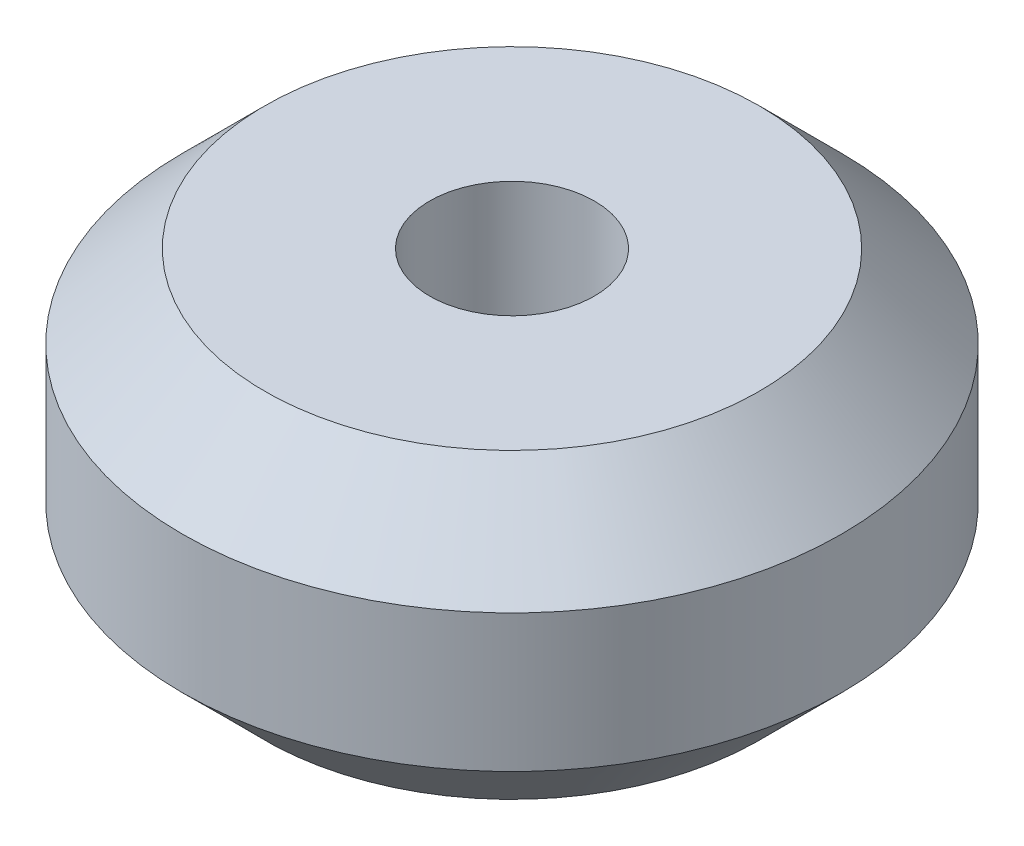
ISO-10303-21;
HEADER;
FILE_DESCRIPTION(('STEP AP214'),'2;1');
FILE_NAME('part.step','',(''),(''),'','','');
FILE_SCHEMA(('AUTOMOTIVE_DESIGN { 1 0 10303 214 1 1 1 1 }'));
ENDSEC;
DATA;
#1=APPLICATION_CONTEXT('core data for automotive mechanical design processes');
#2=APPLICATION_PROTOCOL_DEFINITION('international standard','automotive_design',2000,#1);
#3=PRODUCT_CONTEXT('',#1,'mechanical');
#4=PRODUCT('Part','Part','',(#3));
#5=PRODUCT_RELATED_PRODUCT_CATEGORY('part','',(#4));
#6=PRODUCT_DEFINITION_FORMATION('','',#4);
#7=PRODUCT_DEFINITION_CONTEXT('part definition',#1,'design');
#8=PRODUCT_DEFINITION('design','',#6,#7);
#9=PRODUCT_DEFINITION_SHAPE('','',#8);
#10=(LENGTH_UNIT() NAMED_UNIT(*) SI_UNIT(.MILLI.,.METRE.));
#11=(NAMED_UNIT(*) PLANE_ANGLE_UNIT() SI_UNIT($,.RADIAN.));
#12=(NAMED_UNIT(*) SI_UNIT($,.STERADIAN.) SOLID_ANGLE_UNIT());
#13=UNCERTAINTY_MEASURE_WITH_UNIT(LENGTH_MEASURE(1.E-05),#10,'distance_accuracy_value','');
#14=(GEOMETRIC_REPRESENTATION_CONTEXT(3) GLOBAL_UNCERTAINTY_ASSIGNED_CONTEXT((#13)) GLOBAL_UNIT_ASSIGNED_CONTEXT((#10,
#11,#12)) REPRESENTATION_CONTEXT('',''));
#15=CARTESIAN_POINT('',(0.,0.,0.));
#16=DIRECTION('',(0.,0.,1.));
#17=DIRECTION('',(1.,0.,0.));
#18=AXIS2_PLACEMENT_3D('',#15,#16,#17);
#19=CARTESIAN_POINT('',(0.,5.5,0.));
#20=DIRECTION('',(0.,-1.,0.));
#21=DIRECTION('',(0.,0.,-1.));
#22=AXIS2_PLACEMENT_3D('',#19,#20,#21);
#23=PLANE('',#22);
#24=CARTESIAN_POINT('',(0.,5.5,0.));
#25=DIRECTION('',(0.,-1.,0.));
#26=DIRECTION('',(0.,0.,-1.));
#27=AXIS2_PLACEMENT_3D('',#24,#25,#26);
#28=CIRCLE('',#27,9.);
#29=CARTESIAN_POINT('',(0.,5.5,-9.));
#30=VERTEX_POINT('',#29);
#31=EDGE_CURVE('E43',#30,#30,#28,.T.);
#32=ORIENTED_EDGE('',*,*,#31,.F.);
#33=EDGE_LOOP('',(#32));
#34=FACE_BOUND('',#33,.T.);
#35=CARTESIAN_POINT('',(0.,5.5,0.));
#36=DIRECTION('',(0.,-1.,0.));
#37=DIRECTION('',(0.,0.,-1.));
#38=AXIS2_PLACEMENT_3D('',#35,#36,#37);
#39=CIRCLE('',#38,3.);
#40=CARTESIAN_POINT('',(0.,5.5,-3.));
#41=VERTEX_POINT('',#40);
#42=EDGE_CURVE('E10',#41,#41,#39,.T.);
#43=ORIENTED_EDGE('',*,*,#42,.T.);
#44=EDGE_LOOP('',(#43));
#45=FACE_BOUND('',#44,.T.);
#46=ADVANCED_FACE('F33',(#34,#45),#23,.F.);
#47=CARTESIAN_POINT('',(0.,0.,0.));
#48=DIRECTION('',(0.,-1.,0.));
#49=DIRECTION('',(0.,0.,-1.));
#50=AXIS2_PLACEMENT_3D('',#47,#48,#49);
#51=CYLINDRICAL_SURFACE('',#50,3.);
#52=ORIENTED_EDGE('',*,*,#42,.F.);
#53=EDGE_LOOP('',(#52));
#54=FACE_BOUND('',#53,.T.);
#55=CARTESIAN_POINT('',(0.,-5.5,0.));
#56=DIRECTION('',(0.,-1.,0.));
#57=DIRECTION('',(0.,0.,-1.));
#58=AXIS2_PLACEMENT_3D('',#55,#56,#57);
#59=CIRCLE('',#58,3.);
#60=CARTESIAN_POINT('',(0.,-5.5,-3.));
#61=VERTEX_POINT('',#60);
#62=EDGE_CURVE('E47',#61,#61,#59,.T.);
#63=ORIENTED_EDGE('',*,*,#62,.T.);
#64=EDGE_LOOP('',(#63));
#65=FACE_BOUND('',#64,.T.);
#66=ADVANCED_FACE('F72',(#54,#65),#51,.F.);
#67=CARTESIAN_POINT('',(0.,0.,0.));
#68=DIRECTION('',(0.,-1.,0.));
#69=DIRECTION('',(0.,0.,-1.));
#70=AXIS2_PLACEMENT_3D('',#67,#68,#69);
#71=CYLINDRICAL_SURFACE('',#70,12.);
#72=CARTESIAN_POINT('',(0.,2.5,0.));
#73=DIRECTION('',(0.,-1.,0.));
#74=DIRECTION('',(0.,0.,-1.));
#75=AXIS2_PLACEMENT_3D('',#72,#73,#74);
#76=CIRCLE('',#75,12.);
#77=CARTESIAN_POINT('',(0.,2.5,-12.));
#78=VERTEX_POINT('',#77);
#79=EDGE_CURVE('E39',#78,#78,#76,.T.);
#80=ORIENTED_EDGE('',*,*,#79,.T.);
#81=EDGE_LOOP('',(#80));
#82=FACE_BOUND('',#81,.T.);
#83=CARTESIAN_POINT('',(0.,-2.5,0.));
#84=DIRECTION('',(0.,-1.,0.));
#85=DIRECTION('',(0.,0.,-1.));
#86=AXIS2_PLACEMENT_3D('',#83,#84,#85);
#87=CIRCLE('',#86,12.);
#88=CARTESIAN_POINT('',(0.,-2.5,-12.));
#89=VERTEX_POINT('',#88);
#90=EDGE_CURVE('E52',#89,#89,#87,.T.);
#91=ORIENTED_EDGE('',*,*,#90,.F.);
#92=EDGE_LOOP('',(#91));
#93=FACE_BOUND('',#92,.T.);
#94=ADVANCED_FACE('F77',(#82,#93),#71,.T.);
#95=CARTESIAN_POINT('',(0.,5.5,0.));
#96=DIRECTION('',(0.,-1.,0.));
#97=DIRECTION('',(0.,0.,-1.));
#98=AXIS2_PLACEMENT_3D('',#95,#96,#97);
#99=CONICAL_SURFACE('',#98,9.,0.785398163397448);
#100=ORIENTED_EDGE('',*,*,#79,.F.);
#101=EDGE_LOOP('',(#100));
#102=FACE_BOUND('',#101,.T.);
#103=ORIENTED_EDGE('',*,*,#31,.T.);
#104=EDGE_LOOP('',(#103));
#105=FACE_BOUND('',#104,.T.);
#106=ADVANCED_FACE('F69',(#102,#105),#99,.T.);
#107=CARTESIAN_POINT('',(0.,-5.5,0.));
#108=DIRECTION('',(0.,1.,0.));
#109=DIRECTION('',(0.,0.,-1.));
#110=AXIS2_PLACEMENT_3D('',#107,#108,#109);
#111=PLANE('',#110);
#112=CARTESIAN_POINT('',(0.,-5.5,0.));
#113=DIRECTION('',(0.,-1.,0.));
#114=DIRECTION('',(0.,0.,-1.));
#115=AXIS2_PLACEMENT_3D('',#112,#113,#114);
#116=CIRCLE('',#115,9.);
#117=CARTESIAN_POINT('',(0.,-5.5,-9.));
#118=VERTEX_POINT('',#117);
#119=EDGE_CURVE('E55',#118,#118,#116,.T.);
#120=ORIENTED_EDGE('',*,*,#119,.T.);
#121=EDGE_LOOP('',(#120));
#122=FACE_BOUND('',#121,.T.);
#123=ORIENTED_EDGE('',*,*,#62,.F.);
#124=EDGE_LOOP('',(#123));
#125=FACE_BOUND('',#124,.T.);
#126=ADVANCED_FACE('F59',(#122,#125),#111,.F.);
#127=CARTESIAN_POINT('',(0.,-5.5,0.));
#128=DIRECTION('',(0.,1.,0.));
#129=DIRECTION('',(0.,0.,-1.));
#130=AXIS2_PLACEMENT_3D('',#127,#128,#129);
#131=CONICAL_SURFACE('',#130,9.,0.785398163397448);
#132=ORIENTED_EDGE('',*,*,#90,.T.);
#133=EDGE_LOOP('',(#132));
#134=FACE_BOUND('',#133,.T.);
#135=ORIENTED_EDGE('',*,*,#119,.F.);
#136=EDGE_LOOP('',(#135));
#137=FACE_BOUND('',#136,.T.);
#138=ADVANCED_FACE('F62',(#134,#137),#131,.T.);
#139=CLOSED_SHELL('',(#46,#66,#94,#106,#126,#138));
#140=MANIFOLD_SOLID_BREP('B2',#139);
#141=ADVANCED_BREP_SHAPE_REPRESENTATION('',(#18,#140),#14);
#142=SHAPE_DEFINITION_REPRESENTATION(#9,#141);
ENDSEC;
END-ISO-10303-21;
